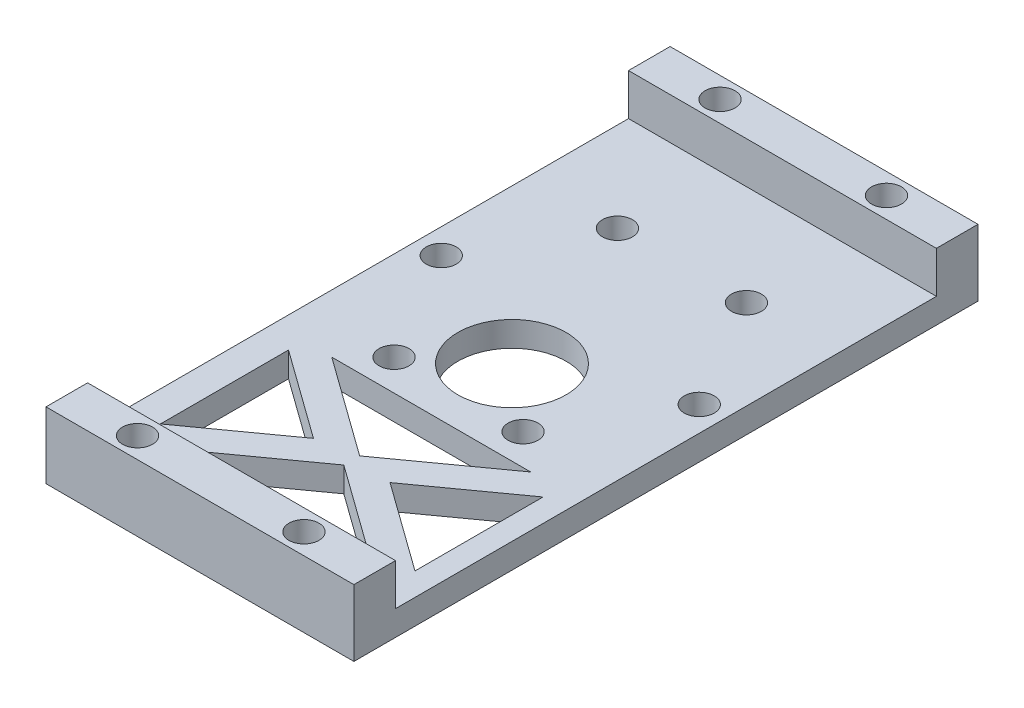
ISO-10303-21;
HEADER;
FILE_DESCRIPTION(('STEP AP214'),'2;1');
FILE_NAME('part.step','',(''),(''),'','','');
FILE_SCHEMA(('AUTOMOTIVE_DESIGN { 1 0 10303 214 1 1 1 1 }'));
ENDSEC;
DATA;
#1=APPLICATION_CONTEXT('core data for automotive mechanical design processes');
#2=APPLICATION_PROTOCOL_DEFINITION('international standard','automotive_design',2000,#1);
#3=PRODUCT_CONTEXT('',#1,'mechanical');
#4=PRODUCT('Part','Part','',(#3));
#5=PRODUCT_RELATED_PRODUCT_CATEGORY('part','',(#4));
#6=PRODUCT_DEFINITION_FORMATION('','',#4);
#7=PRODUCT_DEFINITION_CONTEXT('part definition',#1,'design');
#8=PRODUCT_DEFINITION('design','',#6,#7);
#9=PRODUCT_DEFINITION_SHAPE('','',#8);
#10=(LENGTH_UNIT() NAMED_UNIT(*) SI_UNIT(.MILLI.,.METRE.));
#11=(NAMED_UNIT(*) PLANE_ANGLE_UNIT() SI_UNIT($,.RADIAN.));
#12=(NAMED_UNIT(*) SI_UNIT($,.STERADIAN.) SOLID_ANGLE_UNIT());
#13=UNCERTAINTY_MEASURE_WITH_UNIT(LENGTH_MEASURE(1.E-05),#10,'distance_accuracy_value','');
#14=(GEOMETRIC_REPRESENTATION_CONTEXT(3) GLOBAL_UNCERTAINTY_ASSIGNED_CONTEXT((#13)) GLOBAL_UNIT_ASSIGNED_CONTEXT((#10,
#11,#12)) REPRESENTATION_CONTEXT('',''));
#15=CARTESIAN_POINT('',(0.,0.,0.));
#16=DIRECTION('',(0.,0.,1.));
#17=DIRECTION('',(1.,0.,0.));
#18=AXIS2_PLACEMENT_3D('',#15,#16,#17);
#19=CARTESIAN_POINT('',(0.,3.,0.));
#20=DIRECTION('',(0.,1.,0.));
#21=DIRECTION('',(0.,0.,1.));
#22=AXIS2_PLACEMENT_3D('',#19,#20,#21);
#23=PLANE('',#22);
#24=CARTESIAN_POINT('',(-7.75,3.,13.4233937586588));
#25=DIRECTION('',(0.,1.,0.));
#26=DIRECTION('',(0.,0.,1.));
#27=AXIS2_PLACEMENT_3D('',#24,#25,#26);
#28=CIRCLE('',#27,1.8);
#29=CARTESIAN_POINT('',(-7.75,3.,15.2233937586588));
#30=VERTEX_POINT('',#29);
#31=EDGE_CURVE('E340',#30,#30,#28,.T.);
#32=ORIENTED_EDGE('',*,*,#31,.F.);
#33=EDGE_LOOP('',(#32));
#34=FACE_BOUND('',#33,.T.);
#35=CARTESIAN_POINT('',(15.5,3.,0.));
#36=DIRECTION('',(0.,1.,0.));
#37=DIRECTION('',(0.,0.,1.));
#38=AXIS2_PLACEMENT_3D('',#35,#36,#37);
#39=CIRCLE('',#38,1.8);
#40=CARTESIAN_POINT('',(15.5,3.,1.8));
#41=VERTEX_POINT('',#40);
#42=EDGE_CURVE('E329',#41,#41,#39,.T.);
#43=ORIENTED_EDGE('',*,*,#42,.F.);
#44=EDGE_LOOP('',(#43));
#45=FACE_BOUND('',#44,.T.);
#46=CARTESIAN_POINT('',(-7.75000000000001,3.,-13.4233937586588));
#47=DIRECTION('',(0.,1.,0.));
#48=DIRECTION('',(0.,0.,1.));
#49=AXIS2_PLACEMENT_3D('',#46,#47,#48);
#50=CIRCLE('',#49,1.8);
#51=CARTESIAN_POINT('',(-7.75000000000001,3.,-11.6233937586588));
#52=VERTEX_POINT('',#51);
#53=EDGE_CURVE('E316',#52,#52,#50,.T.);
#54=ORIENTED_EDGE('',*,*,#53,.F.);
#55=EDGE_LOOP('',(#54));
#56=FACE_BOUND('',#55,.T.);
#57=CARTESIAN_POINT('',(-15.5,3.,0.));
#58=DIRECTION('',(0.,1.,0.));
#59=DIRECTION('',(0.,0.,1.));
#60=AXIS2_PLACEMENT_3D('',#57,#58,#59);
#61=CIRCLE('',#60,1.8);
#62=CARTESIAN_POINT('',(-15.5,3.,1.8));
#63=VERTEX_POINT('',#62);
#64=EDGE_CURVE('E313',#63,#63,#61,.T.);
#65=ORIENTED_EDGE('',*,*,#64,.F.);
#66=EDGE_LOOP('',(#65));
#67=FACE_BOUND('',#66,.T.);
#68=CARTESIAN_POINT('',(7.74999999999999,3.,-13.4233937586588));
#69=DIRECTION('',(0.,1.,0.));
#70=DIRECTION('',(0.,0.,1.));
#71=AXIS2_PLACEMENT_3D('',#68,#69,#70);
#72=CIRCLE('',#71,1.8);
#73=CARTESIAN_POINT('',(7.74999999999999,3.,-11.6233937586588));
#74=VERTEX_POINT('',#73);
#75=EDGE_CURVE('E323',#74,#74,#72,.T.);
#76=ORIENTED_EDGE('',*,*,#75,.F.);
#77=EDGE_LOOP('',(#76));
#78=FACE_BOUND('',#77,.T.);
#79=CARTESIAN_POINT('',(7.75,3.,13.4233937586588));
#80=DIRECTION('',(0.,1.,0.));
#81=DIRECTION('',(0.,0.,1.));
#82=AXIS2_PLACEMENT_3D('',#79,#80,#81);
#83=CIRCLE('',#82,1.8);
#84=CARTESIAN_POINT('',(7.75,3.,15.2233937586588));
#85=VERTEX_POINT('',#84);
#86=EDGE_CURVE('E335',#85,#85,#83,.T.);
#87=ORIENTED_EDGE('',*,*,#86,.F.);
#88=EDGE_LOOP('',(#87));
#89=FACE_BOUND('',#88,.T.);
#90=CARTESIAN_POINT('',(0.,3.,7.));
#91=DIRECTION('',(0.,1.,0.));
#92=DIRECTION('',(0.,0.,1.));
#93=AXIS2_PLACEMENT_3D('',#90,#91,#92);
#94=CIRCLE('',#93,6.5);
#95=CARTESIAN_POINT('',(0.,3.,13.5));
#96=VERTEX_POINT('',#95);
#97=EDGE_CURVE('E345',#96,#96,#94,.T.);
#98=ORIENTED_EDGE('',*,*,#97,.F.);
#99=EDGE_LOOP('',(#98));
#100=FACE_BOUND('',#99,.T.);
#101=DIRECTION('',(-0.81166315089851,0.,0.584125782236585));
#102=VECTOR('',#101,1.);
#103=CARTESIAN_POINT('',(13.2670600520474,3.,18.4350427467403));
#104=LINE('',#103,#102);
#105=CARTESIAN_POINT('',(0.450193864732995,3.,27.6588962371925));
#106=VERTEX_POINT('',#105);
#107=CARTESIAN_POINT('',(-11.5049543209545,3.,36.2626012076454));
#108=VERTEX_POINT('',#107);
#109=EDGE_CURVE('E371',#106,#108,#104,.T.);
#110=ORIENTED_EDGE('',*,*,#109,.F.);
#111=DIRECTION('',(-0.81166315089851,0.,-0.584125782236585));
#112=VECTOR('',#111,1.);
#113=CARTESIAN_POINT('',(-12.9598451210916,3.,18.0081568833773));
#114=LINE('',#113,#112);
#115=CARTESIAN_POINT('',(12.4053420504205,3.,36.2626012076454));
#116=VERTEX_POINT('',#115);
#117=EDGE_CURVE('E365',#116,#106,#114,.T.);
#118=ORIENTED_EDGE('',*,*,#117,.F.);
#119=DIRECTION('',(1.,0.,0.));
#120=VECTOR('',#119,1.);
#121=CARTESIAN_POINT('',(0.,3.,36.2626012076454));
#122=LINE('',#121,#120);
#123=EDGE_CURVE('E368',#108,#116,#122,.T.);
#124=ORIENTED_EDGE('',*,*,#123,.F.);
#125=EDGE_LOOP('',(#110,#118,#124));
#126=FACE_BOUND('',#125,.T.);
#127=DIRECTION('',(0.,0.,-1.));
#128=VECTOR('',#127,1.);
#129=CARTESIAN_POINT('',(15.7466208632358,3.,0.));
#130=LINE('',#129,#128);
#131=CARTESIAN_POINT('',(15.7466208632358,3.,34.4050964006598));
#132=VERTEX_POINT('',#131);
#133=CARTESIAN_POINT('',(15.7466208632358,3.,19.0118775337415));
#134=VERTEX_POINT('',#133);
#135=EDGE_CURVE('E378',#132,#134,#130,.T.);
#136=ORIENTED_EDGE('',*,*,#135,.F.);
#137=DIRECTION('',(0.811663150898511,0.,0.584125782236585));
#138=VECTOR('',#137,1.);
#139=CARTESIAN_POINT('',(-10.9391231326954,3.,15.2002931901988));
#140=LINE('',#139,#138);
#141=CARTESIAN_POINT('',(5.05191356906877,3.,26.7084869672006));
#142=VERTEX_POINT('',#141);
#143=EDGE_CURVE('E373',#142,#132,#140,.T.);
#144=ORIENTED_EDGE('',*,*,#143,.F.);
#145=DIRECTION('',(-0.81166315089851,0.,0.584125782236585));
#146=VECTOR('',#145,1.);
#147=CARTESIAN_POINT('',(14.3865785511218,3.,19.990652754175));
#148=LINE('',#147,#146);
#149=EDGE_CURVE('E375',#134,#142,#148,.T.);
#150=ORIENTED_EDGE('',*,*,#149,.F.);
#151=EDGE_LOOP('',(#136,#144,#150));
#152=FACE_BOUND('',#151,.T.);
#153=DIRECTION('',(0.81166315089851,0.,-0.584125782236585));
#154=VECTOR('',#153,1.);
#155=CARTESIAN_POINT('',(12.3658565627255,3.,17.1827890609965));
#156=LINE('',#155,#154);
#157=CARTESIAN_POINT('',(0.450193864732995,3.,25.7580776972088));
#158=VERTEX_POINT('',#157);
#159=CARTESIAN_POINT('',(12.4053420504205,3.,17.1543727267559));
#160=VERTEX_POINT('',#159);
#161=EDGE_CURVE('E385',#158,#160,#156,.T.);
#162=ORIENTED_EDGE('',*,*,#161,.F.);
#163=DIRECTION('',(0.81166315089851,0.,0.584125782236585));
#164=VECTOR('',#163,1.);
#165=CARTESIAN_POINT('',(-12.0586416317698,3.,16.7559031976336));
#166=LINE('',#165,#164);
#167=CARTESIAN_POINT('',(-11.5049543209545,3.,17.1543727267559));
#168=VERTEX_POINT('',#167);
#169=EDGE_CURVE('E380',#168,#158,#166,.T.);
#170=ORIENTED_EDGE('',*,*,#169,.F.);
#171=DIRECTION('',(-1.,0.,0.));
#172=VECTOR('',#171,1.);
#173=CARTESIAN_POINT('',(0.,3.,17.1543727267559));
#174=LINE('',#173,#172);
#175=EDGE_CURVE('E382',#160,#168,#174,.T.);
#176=ORIENTED_EDGE('',*,*,#175,.F.);
#177=EDGE_LOOP('',(#162,#170,#176));
#178=FACE_BOUND('',#177,.T.);
#179=DIRECTION('',(0.81166315089851,0.,-0.584125782236585));
#180=VECTOR('',#179,1.);
#181=CARTESIAN_POINT('',(11.2463380636512,3.,15.6271790535618));
#182=LINE('',#181,#180);
#183=CARTESIAN_POINT('',(-14.8462331337698,3.,34.4050964006598));
#184=VERTEX_POINT('',#183);
#185=CARTESIAN_POINT('',(-4.15152583960277,3.,26.7084869672006));
#186=VERTEX_POINT('',#185);
#187=EDGE_CURVE('E11',#184,#186,#182,.T.);
#188=ORIENTED_EDGE('',*,*,#187,.F.);
#189=DIRECTION('',(0.,0.,1.));
#190=VECTOR('',#189,1.);
#191=CARTESIAN_POINT('',(-14.8462331337698,3.,0.));
#192=LINE('',#191,#190);
#193=CARTESIAN_POINT('',(-14.8462331337698,3.,19.0118775337415));
#194=VERTEX_POINT('',#193);
#195=EDGE_CURVE('E387',#194,#184,#192,.T.);
#196=ORIENTED_EDGE('',*,*,#195,.F.);
#197=DIRECTION('',(-0.81166315089851,0.,-0.584125782236585));
#198=VECTOR('',#197,1.);
#199=CARTESIAN_POINT('',(-14.079363620166,3.,19.563766890812));
#200=LINE('',#199,#198);
#201=EDGE_CURVE('E45',#186,#194,#200,.T.);
#202=ORIENTED_EDGE('',*,*,#201,.F.);
#203=EDGE_LOOP('',(#188,#196,#202));
#204=FACE_BOUND('',#203,.T.);
#205=DIRECTION('',(0.,0.,-1.));
#206=VECTOR('',#205,1.);
#207=CARTESIAN_POINT('',(-18.5,3.,0.));
#208=LINE('',#207,#206);
#209=CARTESIAN_POINT('',(-18.5,3.,39.5));
#210=VERTEX_POINT('',#209);
#211=CARTESIAN_POINT('',(-18.5,3.,-25.5));
#212=VERTEX_POINT('',#211);
#213=EDGE_CURVE('E57',#210,#212,#208,.T.);
#214=ORIENTED_EDGE('',*,*,#213,.F.);
#215=DIRECTION('',(-1.,0.,0.));
#216=VECTOR('',#215,1.);
#217=CARTESIAN_POINT('',(-18.5,3.,39.5));
#218=LINE('',#217,#216);
#219=CARTESIAN_POINT('',(18.5,3.,39.5));
#220=VERTEX_POINT('',#219);
#221=EDGE_CURVE('E197',#220,#210,#218,.T.);
#222=ORIENTED_EDGE('',*,*,#221,.F.);
#223=DIRECTION('',(0.,0.,1.));
#224=VECTOR('',#223,1.);
#225=CARTESIAN_POINT('',(18.5,3.,0.));
#226=LINE('',#225,#224);
#227=CARTESIAN_POINT('',(18.5,3.,-25.5));
#228=VERTEX_POINT('',#227);
#229=EDGE_CURVE('E355',#228,#220,#226,.T.);
#230=ORIENTED_EDGE('',*,*,#229,.F.);
#231=DIRECTION('',(1.,0.,0.));
#232=VECTOR('',#231,1.);
#233=CARTESIAN_POINT('',(-18.5,3.,-25.5));
#234=LINE('',#233,#232);
#235=EDGE_CURVE('E215',#212,#228,#234,.T.);
#236=ORIENTED_EDGE('',*,*,#235,.F.);
#237=EDGE_LOOP('',(#214,#222,#230,#236));
#238=FACE_BOUND('',#237,.T.);
#239=ADVANCED_FACE('F37',(#34,#45,#56,#67,#78,#89,#100,#126,#152,#178,#204,#238),#23,.T.);
#240=CARTESIAN_POINT('',(0.,0.,0.));
#241=DIRECTION('',(0.,1.,0.));
#242=DIRECTION('',(0.,0.,1.));
#243=AXIS2_PLACEMENT_3D('',#240,#241,#242);
#244=PLANE('',#243);
#245=DIRECTION('',(0.,0.,-1.));
#246=VECTOR('',#245,1.);
#247=CARTESIAN_POINT('',(-14.8462331337698,0.,34.4050964006598));
#248=LINE('',#247,#246);
#249=CARTESIAN_POINT('',(-14.8462331337698,0.,34.4050964006598));
#250=VERTEX_POINT('',#249);
#251=CARTESIAN_POINT('',(-14.8462331337698,0.,19.0118775337415));
#252=VERTEX_POINT('',#251);
#253=EDGE_CURVE('E252',#250,#252,#248,.T.);
#254=ORIENTED_EDGE('',*,*,#253,.F.);
#255=DIRECTION('',(-0.81166315089851,0.,0.584125782236585));
#256=VECTOR('',#255,1.);
#257=CARTESIAN_POINT('',(-4.15152583960277,0.,26.7084869672006));
#258=LINE('',#257,#256);
#259=CARTESIAN_POINT('',(-4.15152583960277,0.,26.7084869672006));
#260=VERTEX_POINT('',#259);
#261=EDGE_CURVE('E246',#260,#250,#258,.T.);
#262=ORIENTED_EDGE('',*,*,#261,.F.);
#263=DIRECTION('',(0.81166315089851,0.,0.584125782236585));
#264=VECTOR('',#263,1.);
#265=CARTESIAN_POINT('',(-14.8462331337698,0.,19.0118775337415));
#266=LINE('',#265,#264);
#267=EDGE_CURVE('E255',#252,#260,#266,.T.);
#268=ORIENTED_EDGE('',*,*,#267,.F.);
#269=EDGE_LOOP('',(#254,#262,#268));
#270=FACE_BOUND('',#269,.T.);
#271=DIRECTION('',(-0.81166315089851,0.,-0.584125782236585));
#272=VECTOR('',#271,1.);
#273=CARTESIAN_POINT('',(0.450193864732995,0.,25.7580776972088));
#274=LINE('',#273,#272);
#275=CARTESIAN_POINT('',(0.450193864732995,0.,25.7580776972088));
#276=VERTEX_POINT('',#275);
#277=CARTESIAN_POINT('',(-11.5049543209545,0.,17.1543727267559));
#278=VERTEX_POINT('',#277);
#279=EDGE_CURVE('E267',#276,#278,#274,.T.);
#280=ORIENTED_EDGE('',*,*,#279,.F.);
#281=DIRECTION('',(-0.81166315089851,0.,0.584125782236585));
#282=VECTOR('',#281,1.);
#283=CARTESIAN_POINT('',(12.4053420504205,0.,17.1543727267559));
#284=LINE('',#283,#282);
#285=CARTESIAN_POINT('',(12.4053420504205,0.,17.1543727267559));
#286=VERTEX_POINT('',#285);
#287=EDGE_CURVE('E261',#286,#276,#284,.T.);
#288=ORIENTED_EDGE('',*,*,#287,.F.);
#289=DIRECTION('',(1.,0.,0.));
#290=VECTOR('',#289,1.);
#291=CARTESIAN_POINT('',(-11.5049543209545,0.,17.1543727267559));
#292=LINE('',#291,#290);
#293=EDGE_CURVE('E270',#278,#286,#292,.T.);
#294=ORIENTED_EDGE('',*,*,#293,.F.);
#295=EDGE_LOOP('',(#280,#288,#294));
#296=FACE_BOUND('',#295,.T.);
#297=DIRECTION('',(-0.81166315089851,0.,-0.584125782236585));
#298=VECTOR('',#297,1.);
#299=CARTESIAN_POINT('',(5.05191356906876,0.,26.7084869672006));
#300=LINE('',#299,#298);
#301=CARTESIAN_POINT('',(15.7466208632358,0.,34.4050964006598));
#302=VERTEX_POINT('',#301);
#303=CARTESIAN_POINT('',(5.05191356906876,0.,26.7084869672006));
#304=VERTEX_POINT('',#303);
#305=EDGE_CURVE('E237',#302,#304,#300,.T.);
#306=ORIENTED_EDGE('',*,*,#305,.F.);
#307=DIRECTION('',(0.,0.,1.));
#308=VECTOR('',#307,1.);
#309=CARTESIAN_POINT('',(15.7466208632358,0.,34.4050964006598));
#310=LINE('',#309,#308);
#311=CARTESIAN_POINT('',(15.7466208632358,0.,19.0118775337415));
#312=VERTEX_POINT('',#311);
#313=EDGE_CURVE('E235',#312,#302,#310,.T.);
#314=ORIENTED_EDGE('',*,*,#313,.F.);
#315=DIRECTION('',(0.81166315089851,0.,-0.584125782236585));
#316=VECTOR('',#315,1.);
#317=CARTESIAN_POINT('',(15.7466208632358,0.,19.0118775337415));
#318=LINE('',#317,#316);
#319=EDGE_CURVE('E240',#304,#312,#318,.T.);
#320=ORIENTED_EDGE('',*,*,#319,.F.);
#321=EDGE_LOOP('',(#306,#314,#320));
#322=FACE_BOUND('',#321,.T.);
#323=DIRECTION('',(0.81166315089851,0.,0.584125782236585));
#324=VECTOR('',#323,1.);
#325=CARTESIAN_POINT('',(12.4053420504205,0.,36.2626012076454));
#326=LINE('',#325,#324);
#327=CARTESIAN_POINT('',(0.450193864732995,0.,27.6588962371925));
#328=VERTEX_POINT('',#327);
#329=CARTESIAN_POINT('',(12.4053420504205,0.,36.2626012076454));
#330=VERTEX_POINT('',#329);
#331=EDGE_CURVE('E282',#328,#330,#326,.T.);
#332=ORIENTED_EDGE('',*,*,#331,.F.);
#333=DIRECTION('',(0.81166315089851,0.,-0.584125782236585));
#334=VECTOR('',#333,1.);
#335=CARTESIAN_POINT('',(0.450193864732995,0.,27.6588962371925));
#336=LINE('',#335,#334);
#337=CARTESIAN_POINT('',(-11.5049543209545,0.,36.2626012076454));
#338=VERTEX_POINT('',#337);
#339=EDGE_CURVE('E276',#338,#328,#336,.T.);
#340=ORIENTED_EDGE('',*,*,#339,.F.);
#341=DIRECTION('',(-1.,0.,0.));
#342=VECTOR('',#341,1.);
#343=CARTESIAN_POINT('',(-11.5049543209545,0.,36.2626012076454));
#344=LINE('',#343,#342);
#345=EDGE_CURVE('E285',#330,#338,#344,.T.);
#346=ORIENTED_EDGE('',*,*,#345,.F.);
#347=EDGE_LOOP('',(#332,#340,#346));
#348=FACE_BOUND('',#347,.T.);
#349=CARTESIAN_POINT('',(-10.,0.,42.));
#350=DIRECTION('',(0.,-1.,0.));
#351=DIRECTION('',(0.,0.,-1.));
#352=AXIS2_PLACEMENT_3D('',#349,#350,#351);
#353=CIRCLE('',#352,1.8);
#354=CARTESIAN_POINT('',(-10.,0.,40.2));
#355=VERTEX_POINT('',#354);
#356=EDGE_CURVE('E296',#355,#355,#353,.T.);
#357=ORIENTED_EDGE('',*,*,#356,.F.);
#358=EDGE_LOOP('',(#357));
#359=FACE_BOUND('',#358,.T.);
#360=CARTESIAN_POINT('',(9.99999999999999,0.,42.));
#361=DIRECTION('',(0.,-1.,0.));
#362=DIRECTION('',(0.,0.,-1.));
#363=AXIS2_PLACEMENT_3D('',#360,#361,#362);
#364=CIRCLE('',#363,1.8);
#365=CARTESIAN_POINT('',(9.99999999999999,0.,40.2));
#366=VERTEX_POINT('',#365);
#367=EDGE_CURVE('E300',#366,#366,#364,.T.);
#368=ORIENTED_EDGE('',*,*,#367,.F.);
#369=EDGE_LOOP('',(#368));
#370=FACE_BOUND('',#369,.T.);
#371=CARTESIAN_POINT('',(-10.,0.,-28.));
#372=DIRECTION('',(0.,-1.,0.));
#373=DIRECTION('',(0.,0.,-1.));
#374=AXIS2_PLACEMENT_3D('',#371,#372,#373);
#375=CIRCLE('',#374,1.8);
#376=CARTESIAN_POINT('',(-10.,0.,-29.8));
#377=VERTEX_POINT('',#376);
#378=EDGE_CURVE('E303',#377,#377,#375,.T.);
#379=ORIENTED_EDGE('',*,*,#378,.F.);
#380=EDGE_LOOP('',(#379));
#381=FACE_BOUND('',#380,.T.);
#382=CARTESIAN_POINT('',(10.,0.,-28.));
#383=DIRECTION('',(0.,-1.,0.));
#384=DIRECTION('',(0.,0.,-1.));
#385=AXIS2_PLACEMENT_3D('',#382,#383,#384);
#386=CIRCLE('',#385,1.8);
#387=CARTESIAN_POINT('',(10.,0.,-29.8));
#388=VERTEX_POINT('',#387);
#389=EDGE_CURVE('E291',#388,#388,#386,.T.);
#390=ORIENTED_EDGE('',*,*,#389,.F.);
#391=EDGE_LOOP('',(#390));
#392=FACE_BOUND('',#391,.T.);
#393=CARTESIAN_POINT('',(0.,0.,7.));
#394=DIRECTION('',(0.,1.,0.));
#395=DIRECTION('',(0.,0.,1.));
#396=AXIS2_PLACEMENT_3D('',#393,#394,#395);
#397=CIRCLE('',#396,6.5);
#398=CARTESIAN_POINT('',(0.,0.,13.5));
#399=VERTEX_POINT('',#398);
#400=EDGE_CURVE('E299',#399,#399,#397,.T.);
#401=ORIENTED_EDGE('',*,*,#400,.T.);
#402=EDGE_LOOP('',(#401));
#403=FACE_BOUND('',#402,.T.);
#404=DIRECTION('',(0.,0.,-1.));
#405=VECTOR('',#404,1.);
#406=CARTESIAN_POINT('',(18.5,0.,0.));
#407=LINE('',#406,#405);
#408=CARTESIAN_POINT('',(18.5,0.,44.5));
#409=VERTEX_POINT('',#408);
#410=CARTESIAN_POINT('',(18.5,0.,-30.5));
#411=VERTEX_POINT('',#410);
#412=EDGE_CURVE('E356',#409,#411,#407,.T.);
#413=ORIENTED_EDGE('',*,*,#412,.F.);
#414=DIRECTION('',(-1.,0.,0.));
#415=VECTOR('',#414,1.);
#416=CARTESIAN_POINT('',(0.,0.,44.5));
#417=LINE('',#416,#415);
#418=CARTESIAN_POINT('',(-18.5,0.,44.5));
#419=VERTEX_POINT('',#418);
#420=EDGE_CURVE('E312',#409,#419,#417,.T.);
#421=ORIENTED_EDGE('',*,*,#420,.T.);
#422=DIRECTION('',(0.,0.,1.));
#423=VECTOR('',#422,1.);
#424=CARTESIAN_POINT('',(-18.5,0.,0.));
#425=LINE('',#424,#423);
#426=CARTESIAN_POINT('',(-18.5,0.,-30.5));
#427=VERTEX_POINT('',#426);
#428=EDGE_CURVE('E178',#427,#419,#425,.T.);
#429=ORIENTED_EDGE('',*,*,#428,.F.);
#430=DIRECTION('',(-1.,0.,0.));
#431=VECTOR('',#430,1.);
#432=CARTESIAN_POINT('',(0.,0.,-30.5));
#433=LINE('',#432,#431);
#434=EDGE_CURVE('E182',#411,#427,#433,.T.);
#435=ORIENTED_EDGE('',*,*,#434,.F.);
#436=EDGE_LOOP('',(#413,#421,#429,#435));
#437=FACE_BOUND('',#436,.T.);
#438=CARTESIAN_POINT('',(-15.5,0.,0.));
#439=DIRECTION('',(0.,1.,0.));
#440=DIRECTION('',(0.,0.,1.));
#441=AXIS2_PLACEMENT_3D('',#438,#439,#440);
#442=CIRCLE('',#441,1.8);
#443=CARTESIAN_POINT('',(-15.5,0.,1.8));
#444=VERTEX_POINT('',#443);
#445=EDGE_CURVE('E308',#444,#444,#442,.T.);
#446=ORIENTED_EDGE('',*,*,#445,.T.);
#447=EDGE_LOOP('',(#446));
#448=FACE_BOUND('',#447,.T.);
#449=CARTESIAN_POINT('',(-7.75000000000001,0.,-13.4233937586588));
#450=DIRECTION('',(0.,1.,0.));
#451=DIRECTION('',(0.,0.,1.));
#452=AXIS2_PLACEMENT_3D('',#449,#450,#451);
#453=CIRCLE('',#452,1.8);
#454=CARTESIAN_POINT('',(-7.75000000000001,0.,-11.6233937586588));
#455=VERTEX_POINT('',#454);
#456=EDGE_CURVE('E311',#455,#455,#453,.T.);
#457=ORIENTED_EDGE('',*,*,#456,.T.);
#458=EDGE_LOOP('',(#457));
#459=FACE_BOUND('',#458,.T.);
#460=CARTESIAN_POINT('',(7.74999999999999,0.,-13.4233937586588));
#461=DIRECTION('',(0.,1.,0.));
#462=DIRECTION('',(0.,0.,1.));
#463=AXIS2_PLACEMENT_3D('',#460,#461,#462);
#464=CIRCLE('',#463,1.8);
#465=CARTESIAN_POINT('',(7.74999999999999,0.,-11.6233937586588));
#466=VERTEX_POINT('',#465);
#467=EDGE_CURVE('E320',#466,#466,#464,.T.);
#468=ORIENTED_EDGE('',*,*,#467,.T.);
#469=EDGE_LOOP('',(#468));
#470=FACE_BOUND('',#469,.T.);
#471=CARTESIAN_POINT('',(15.5,0.,0.));
#472=DIRECTION('',(0.,1.,0.));
#473=DIRECTION('',(0.,0.,1.));
#474=AXIS2_PLACEMENT_3D('',#471,#472,#473);
#475=CIRCLE('',#474,1.8);
#476=CARTESIAN_POINT('',(15.5,0.,1.8));
#477=VERTEX_POINT('',#476);
#478=EDGE_CURVE('E326',#477,#477,#475,.T.);
#479=ORIENTED_EDGE('',*,*,#478,.T.);
#480=EDGE_LOOP('',(#479));
#481=FACE_BOUND('',#480,.T.);
#482=CARTESIAN_POINT('',(7.75,0.,13.4233937586588));
#483=DIRECTION('',(0.,1.,0.));
#484=DIRECTION('',(0.,0.,1.));
#485=AXIS2_PLACEMENT_3D('',#482,#483,#484);
#486=CIRCLE('',#485,1.8);
#487=CARTESIAN_POINT('',(7.75,0.,15.2233937586588));
#488=VERTEX_POINT('',#487);
#489=EDGE_CURVE('E332',#488,#488,#486,.T.);
#490=ORIENTED_EDGE('',*,*,#489,.T.);
#491=EDGE_LOOP('',(#490));
#492=FACE_BOUND('',#491,.T.);
#493=CARTESIAN_POINT('',(-7.75,0.,13.4233937586588));
#494=DIRECTION('',(0.,1.,0.));
#495=DIRECTION('',(0.,0.,1.));
#496=AXIS2_PLACEMENT_3D('',#493,#494,#495);
#497=CIRCLE('',#496,1.8);
#498=CARTESIAN_POINT('',(-7.75,0.,15.2233937586588));
#499=VERTEX_POINT('',#498);
#500=EDGE_CURVE('E317',#499,#499,#497,.T.);
#501=ORIENTED_EDGE('',*,*,#500,.T.);
#502=EDGE_LOOP('',(#501));
#503=FACE_BOUND('',#502,.T.);
#504=ADVANCED_FACE('F406',(#270,#296,#322,#348,#359,#370,#381,#392,#403,#437,#448,#459,#470,
#481,#492,#503),#244,.F.);
#505=CARTESIAN_POINT('',(-7.75,3.,13.4233937586588));
#506=DIRECTION('',(0.,-1.,0.));
#507=DIRECTION('',(0.,0.,-1.));
#508=AXIS2_PLACEMENT_3D('',#505,#506,#507);
#509=CYLINDRICAL_SURFACE('',#508,1.8);
#510=ORIENTED_EDGE('',*,*,#31,.T.);
#511=EDGE_LOOP('',(#510));
#512=FACE_BOUND('',#511,.T.);
#513=ORIENTED_EDGE('',*,*,#500,.F.);
#514=EDGE_LOOP('',(#513));
#515=FACE_BOUND('',#514,.T.);
#516=ADVANCED_FACE('F409',(#512,#515),#509,.F.);
#517=CARTESIAN_POINT('',(15.5,3.,0.));
#518=DIRECTION('',(0.,-1.,0.));
#519=DIRECTION('',(0.,0.,-1.));
#520=AXIS2_PLACEMENT_3D('',#517,#518,#519);
#521=CYLINDRICAL_SURFACE('',#520,1.8);
#522=ORIENTED_EDGE('',*,*,#42,.T.);
#523=EDGE_LOOP('',(#522));
#524=FACE_BOUND('',#523,.T.);
#525=ORIENTED_EDGE('',*,*,#478,.F.);
#526=EDGE_LOOP('',(#525));
#527=FACE_BOUND('',#526,.T.);
#528=ADVANCED_FACE('F447',(#524,#527),#521,.F.);
#529=CARTESIAN_POINT('',(-7.75000000000001,3.,-13.4233937586588));
#530=DIRECTION('',(0.,-1.,0.));
#531=DIRECTION('',(0.,0.,-1.));
#532=AXIS2_PLACEMENT_3D('',#529,#530,#531);
#533=CYLINDRICAL_SURFACE('',#532,1.8);
#534=ORIENTED_EDGE('',*,*,#53,.T.);
#535=EDGE_LOOP('',(#534));
#536=FACE_BOUND('',#535,.T.);
#537=ORIENTED_EDGE('',*,*,#456,.F.);
#538=EDGE_LOOP('',(#537));
#539=FACE_BOUND('',#538,.T.);
#540=ADVANCED_FACE('F453',(#536,#539),#533,.F.);
#541=CARTESIAN_POINT('',(-15.5,3.,0.));
#542=DIRECTION('',(0.,-1.,0.));
#543=DIRECTION('',(0.,0.,-1.));
#544=AXIS2_PLACEMENT_3D('',#541,#542,#543);
#545=CYLINDRICAL_SURFACE('',#544,1.8);
#546=ORIENTED_EDGE('',*,*,#64,.T.);
#547=EDGE_LOOP('',(#546));
#548=FACE_BOUND('',#547,.T.);
#549=ORIENTED_EDGE('',*,*,#445,.F.);
#550=EDGE_LOOP('',(#549));
#551=FACE_BOUND('',#550,.T.);
#552=ADVANCED_FACE('F469',(#548,#551),#545,.F.);
#553=CARTESIAN_POINT('',(7.74999999999999,3.,-13.4233937586588));
#554=DIRECTION('',(0.,-1.,0.));
#555=DIRECTION('',(0.,0.,-1.));
#556=AXIS2_PLACEMENT_3D('',#553,#554,#555);
#557=CYLINDRICAL_SURFACE('',#556,1.8);
#558=ORIENTED_EDGE('',*,*,#75,.T.);
#559=EDGE_LOOP('',(#558));
#560=FACE_BOUND('',#559,.T.);
#561=ORIENTED_EDGE('',*,*,#467,.F.);
#562=EDGE_LOOP('',(#561));
#563=FACE_BOUND('',#562,.T.);
#564=ADVANCED_FACE('F472',(#560,#563),#557,.F.);
#565=CARTESIAN_POINT('',(7.75,3.,13.4233937586588));
#566=DIRECTION('',(0.,-1.,0.));
#567=DIRECTION('',(0.,0.,-1.));
#568=AXIS2_PLACEMENT_3D('',#565,#566,#567);
#569=CYLINDRICAL_SURFACE('',#568,1.8);
#570=ORIENTED_EDGE('',*,*,#86,.T.);
#571=EDGE_LOOP('',(#570));
#572=FACE_BOUND('',#571,.T.);
#573=ORIENTED_EDGE('',*,*,#489,.F.);
#574=EDGE_LOOP('',(#573));
#575=FACE_BOUND('',#574,.T.);
#576=ADVANCED_FACE('F478',(#572,#575),#569,.F.);
#577=CARTESIAN_POINT('',(0.,0.,7.));
#578=DIRECTION('',(0.,1.,0.));
#579=DIRECTION('',(0.,0.,1.));
#580=AXIS2_PLACEMENT_3D('',#577,#578,#579);
#581=CYLINDRICAL_SURFACE('',#580,6.5);
#582=ORIENTED_EDGE('',*,*,#400,.F.);
#583=EDGE_LOOP('',(#582));
#584=FACE_BOUND('',#583,.T.);
#585=ORIENTED_EDGE('',*,*,#97,.T.);
#586=EDGE_LOOP('',(#585));
#587=FACE_BOUND('',#586,.T.);
#588=ADVANCED_FACE('F481',(#584,#587),#581,.F.);
#589=CARTESIAN_POINT('',(0.,-57.8727051380873,44.5));
#590=DIRECTION('',(0.,0.,1.));
#591=DIRECTION('',(1.,0.,0.));
#592=AXIS2_PLACEMENT_3D('',#589,#590,#591);
#593=PLANE('',#592);
#594=DIRECTION('',(0.,1.,0.));
#595=VECTOR('',#594,1.);
#596=CARTESIAN_POINT('',(18.5,-57.8727051380873,44.5));
#597=LINE('',#596,#595);
#598=CARTESIAN_POINT('',(18.5,8.,44.5));
#599=VERTEX_POINT('',#598);
#600=EDGE_CURVE('E188',#409,#599,#597,.T.);
#601=ORIENTED_EDGE('',*,*,#600,.T.);
#602=DIRECTION('',(1.,0.,0.));
#603=VECTOR('',#602,1.);
#604=CARTESIAN_POINT('',(-18.5,8.,44.5));
#605=LINE('',#604,#603);
#606=CARTESIAN_POINT('',(-18.5,8.,44.5));
#607=VERTEX_POINT('',#606);
#608=EDGE_CURVE('E185',#607,#599,#605,.T.);
#609=ORIENTED_EDGE('',*,*,#608,.F.);
#610=DIRECTION('',(0.,1.,0.));
#611=VECTOR('',#610,1.);
#612=CARTESIAN_POINT('',(-18.5,-57.8727051380873,44.5));
#613=LINE('',#612,#611);
#614=EDGE_CURVE('E172',#419,#607,#613,.T.);
#615=ORIENTED_EDGE('',*,*,#614,.F.);
#616=ORIENTED_EDGE('',*,*,#420,.F.);
#617=EDGE_LOOP('',(#601,#609,#615,#616));
#618=FACE_BOUND('',#617,.T.);
#619=ADVANCED_FACE('F186',(#618),#593,.T.);
#620=CARTESIAN_POINT('',(18.5,-57.8727051380873,0.));
#621=DIRECTION('',(-1.,0.,0.));
#622=DIRECTION('',(0.,0.,1.));
#623=AXIS2_PLACEMENT_3D('',#620,#621,#622);
#624=PLANE('',#623);
#625=DIRECTION('',(0.,1.,0.));
#626=VECTOR('',#625,1.);
#627=CARTESIAN_POINT('',(18.5,-57.8727051380873,-30.5));
#628=LINE('',#627,#626);
#629=CARTESIAN_POINT('',(18.5,8.,-30.5));
#630=VERTEX_POINT('',#629);
#631=EDGE_CURVE('E353',#411,#630,#628,.T.);
#632=ORIENTED_EDGE('',*,*,#631,.T.);
#633=DIRECTION('',(0.,0.,-1.));
#634=VECTOR('',#633,1.);
#635=CARTESIAN_POINT('',(18.5,8.,-30.5));
#636=LINE('',#635,#634);
#637=CARTESIAN_POINT('',(18.5,8.,-25.5));
#638=VERTEX_POINT('',#637);
#639=EDGE_CURVE('E221',#638,#630,#636,.T.);
#640=ORIENTED_EDGE('',*,*,#639,.F.);
#641=DIRECTION('',(0.,-1.,0.));
#642=VECTOR('',#641,1.);
#643=CARTESIAN_POINT('',(18.5,8.,-25.5));
#644=LINE('',#643,#642);
#645=EDGE_CURVE('E227',#638,#228,#644,.T.);
#646=ORIENTED_EDGE('',*,*,#645,.T.);
#647=ORIENTED_EDGE('',*,*,#229,.T.);
#648=DIRECTION('',(0.,-1.,0.));
#649=VECTOR('',#648,1.);
#650=CARTESIAN_POINT('',(18.5,8.,39.5));
#651=LINE('',#650,#649);
#652=CARTESIAN_POINT('',(18.5,8.,39.5));
#653=VERTEX_POINT('',#652);
#654=EDGE_CURVE('E207',#653,#220,#651,.T.);
#655=ORIENTED_EDGE('',*,*,#654,.F.);
#656=DIRECTION('',(0.,0.,-1.));
#657=VECTOR('',#656,1.);
#658=CARTESIAN_POINT('',(18.5,8.,44.5));
#659=LINE('',#658,#657);
#660=EDGE_CURVE('E191',#599,#653,#659,.T.);
#661=ORIENTED_EDGE('',*,*,#660,.F.);
#662=ORIENTED_EDGE('',*,*,#600,.F.);
#663=ORIENTED_EDGE('',*,*,#412,.T.);
#664=EDGE_LOOP('',(#632,#640,#646,#647,#655,#661,#662,#663));
#665=FACE_BOUND('',#664,.T.);
#666=ADVANCED_FACE('F39',(#665),#624,.F.);
#667=CARTESIAN_POINT('',(-18.5,-57.8727051380873,0.));
#668=DIRECTION('',(1.,0.,0.));
#669=DIRECTION('',(0.,0.,-1.));
#670=AXIS2_PLACEMENT_3D('',#667,#668,#669);
#671=PLANE('',#670);
#672=ORIENTED_EDGE('',*,*,#614,.T.);
#673=DIRECTION('',(0.,0.,1.));
#674=VECTOR('',#673,1.);
#675=CARTESIAN_POINT('',(-18.5,8.,44.5));
#676=LINE('',#675,#674);
#677=CARTESIAN_POINT('',(-18.5,8.,39.5));
#678=VERTEX_POINT('',#677);
#679=EDGE_CURVE('E176',#678,#607,#676,.T.);
#680=ORIENTED_EDGE('',*,*,#679,.F.);
#681=DIRECTION('',(0.,-1.,0.));
#682=VECTOR('',#681,1.);
#683=CARTESIAN_POINT('',(-18.5,8.,39.5));
#684=LINE('',#683,#682);
#685=EDGE_CURVE('E52',#678,#210,#684,.T.);
#686=ORIENTED_EDGE('',*,*,#685,.T.);
#687=ORIENTED_EDGE('',*,*,#213,.T.);
#688=DIRECTION('',(0.,-1.,0.));
#689=VECTOR('',#688,1.);
#690=CARTESIAN_POINT('',(-18.5,8.,-25.5));
#691=LINE('',#690,#689);
#692=CARTESIAN_POINT('',(-18.5,8.,-25.5));
#693=VERTEX_POINT('',#692);
#694=EDGE_CURVE('E232',#693,#212,#691,.T.);
#695=ORIENTED_EDGE('',*,*,#694,.F.);
#696=DIRECTION('',(0.,0.,1.));
#697=VECTOR('',#696,1.);
#698=CARTESIAN_POINT('',(-18.5,8.,-30.5));
#699=LINE('',#698,#697);
#700=CARTESIAN_POINT('',(-18.5,8.,-30.5));
#701=VERTEX_POINT('',#700);
#702=EDGE_CURVE('E216',#701,#693,#699,.T.);
#703=ORIENTED_EDGE('',*,*,#702,.F.);
#704=DIRECTION('',(0.,1.,0.));
#705=VECTOR('',#704,1.);
#706=CARTESIAN_POINT('',(-18.5,-57.8727051380873,-30.5));
#707=LINE('',#706,#705);
#708=EDGE_CURVE('E348',#427,#701,#707,.T.);
#709=ORIENTED_EDGE('',*,*,#708,.F.);
#710=ORIENTED_EDGE('',*,*,#428,.T.);
#711=EDGE_LOOP('',(#672,#680,#686,#687,#695,#703,#709,#710));
#712=FACE_BOUND('',#711,.T.);
#713=ADVANCED_FACE('F174',(#712),#671,.F.);
#714=CARTESIAN_POINT('',(0.,-57.8727051380873,-30.5));
#715=DIRECTION('',(0.,0.,1.));
#716=DIRECTION('',(1.,0.,0.));
#717=AXIS2_PLACEMENT_3D('',#714,#715,#716);
#718=PLANE('',#717);
#719=ORIENTED_EDGE('',*,*,#708,.T.);
#720=DIRECTION('',(-1.,0.,0.));
#721=VECTOR('',#720,1.);
#722=CARTESIAN_POINT('',(-18.5,8.,-30.5));
#723=LINE('',#722,#721);
#724=EDGE_CURVE('E224',#630,#701,#723,.T.);
#725=ORIENTED_EDGE('',*,*,#724,.F.);
#726=ORIENTED_EDGE('',*,*,#631,.F.);
#727=ORIENTED_EDGE('',*,*,#434,.T.);
#728=EDGE_LOOP('',(#719,#725,#726,#727));
#729=FACE_BOUND('',#728,.T.);
#730=ADVANCED_FACE('F550',(#729),#718,.F.);
#731=CARTESIAN_POINT('',(10.,6.,-28.));
#732=DIRECTION('',(0.,-1.,0.));
#733=DIRECTION('',(0.,0.,-1.));
#734=AXIS2_PLACEMENT_3D('',#731,#732,#733);
#735=CYLINDRICAL_SURFACE('',#734,1.8);
#736=ORIENTED_EDGE('',*,*,#389,.T.);
#737=EDGE_LOOP('',(#736));
#738=FACE_BOUND('',#737,.T.);
#739=CARTESIAN_POINT('',(10.,8.,-28.));
#740=DIRECTION('',(0.,1.,0.));
#741=DIRECTION('',(0.,0.,1.));
#742=AXIS2_PLACEMENT_3D('',#739,#740,#741);
#743=CIRCLE('',#742,1.8);
#744=CARTESIAN_POINT('',(10.,8.,-26.2));
#745=VERTEX_POINT('',#744);
#746=EDGE_CURVE('E212',#745,#745,#743,.T.);
#747=ORIENTED_EDGE('',*,*,#746,.T.);
#748=EDGE_LOOP('',(#747));
#749=FACE_BOUND('',#748,.T.);
#750=ADVANCED_FACE('F547',(#738,#749),#735,.F.);
#751=CARTESIAN_POINT('',(-10.,6.,-28.));
#752=DIRECTION('',(0.,-1.,0.));
#753=DIRECTION('',(0.,0.,-1.));
#754=AXIS2_PLACEMENT_3D('',#751,#752,#753);
#755=CYLINDRICAL_SURFACE('',#754,1.8);
#756=ORIENTED_EDGE('',*,*,#378,.T.);
#757=EDGE_LOOP('',(#756));
#758=FACE_BOUND('',#757,.T.);
#759=CARTESIAN_POINT('',(-10.,8.,-28.));
#760=DIRECTION('',(0.,1.,0.));
#761=DIRECTION('',(0.,0.,1.));
#762=AXIS2_PLACEMENT_3D('',#759,#760,#761);
#763=CIRCLE('',#762,1.8);
#764=CARTESIAN_POINT('',(-10.,8.,-26.2));
#765=VERTEX_POINT('',#764);
#766=EDGE_CURVE('E209',#765,#765,#763,.T.);
#767=ORIENTED_EDGE('',*,*,#766,.T.);
#768=EDGE_LOOP('',(#767));
#769=FACE_BOUND('',#768,.T.);
#770=ADVANCED_FACE('F544',(#758,#769),#755,.F.);
#771=CARTESIAN_POINT('',(9.99999999999999,6.,42.));
#772=DIRECTION('',(0.,-1.,0.));
#773=DIRECTION('',(0.,0.,-1.));
#774=AXIS2_PLACEMENT_3D('',#771,#772,#773);
#775=CYLINDRICAL_SURFACE('',#774,1.8);
#776=ORIENTED_EDGE('',*,*,#367,.T.);
#777=EDGE_LOOP('',(#776));
#778=FACE_BOUND('',#777,.T.);
#779=CARTESIAN_POINT('',(9.99999999999999,8.,42.));
#780=DIRECTION('',(0.,1.,0.));
#781=DIRECTION('',(0.,0.,1.));
#782=AXIS2_PLACEMENT_3D('',#779,#780,#781);
#783=CIRCLE('',#782,1.8);
#784=CARTESIAN_POINT('',(9.99999999999999,8.,43.8));
#785=VERTEX_POINT('',#784);
#786=EDGE_CURVE('E199',#785,#785,#783,.T.);
#787=ORIENTED_EDGE('',*,*,#786,.T.);
#788=EDGE_LOOP('',(#787));
#789=FACE_BOUND('',#788,.T.);
#790=ADVANCED_FACE('F540',(#778,#789),#775,.F.);
#791=CARTESIAN_POINT('',(-10.,6.,42.));
#792=DIRECTION('',(0.,-1.,0.));
#793=DIRECTION('',(0.,0.,-1.));
#794=AXIS2_PLACEMENT_3D('',#791,#792,#793);
#795=CYLINDRICAL_SURFACE('',#794,1.8);
#796=ORIENTED_EDGE('',*,*,#356,.T.);
#797=EDGE_LOOP('',(#796));
#798=FACE_BOUND('',#797,.T.);
#799=CARTESIAN_POINT('',(-10.,8.,42.));
#800=DIRECTION('',(0.,1.,0.));
#801=DIRECTION('',(0.,0.,1.));
#802=AXIS2_PLACEMENT_3D('',#799,#800,#801);
#803=CIRCLE('',#802,1.8);
#804=CARTESIAN_POINT('',(-10.,8.,43.8));
#805=VERTEX_POINT('',#804);
#806=EDGE_CURVE('E935',#805,#805,#803,.T.);
#807=ORIENTED_EDGE('',*,*,#806,.T.);
#808=EDGE_LOOP('',(#807));
#809=FACE_BOUND('',#808,.T.);
#810=ADVANCED_FACE('F536',(#798,#809),#795,.F.);
#811=CARTESIAN_POINT('',(0.450193864732995,15.,27.6588962371925));
#812=DIRECTION('',(-0.584125782236585,0.,-0.81166315089851));
#813=DIRECTION('',(-0.81166315089851,0.,0.584125782236585));
#814=AXIS2_PLACEMENT_3D('',#811,#812,#813);
#815=PLANE('',#814);
#816=ORIENTED_EDGE('',*,*,#109,.T.);
#817=DIRECTION('',(0.,-1.,0.));
#818=VECTOR('',#817,1.);
#819=CARTESIAN_POINT('',(-11.5049543209545,15.,36.2626012076454));
#820=LINE('',#819,#818);
#821=EDGE_CURVE('E289',#108,#338,#820,.T.);
#822=ORIENTED_EDGE('',*,*,#821,.T.);
#823=ORIENTED_EDGE('',*,*,#339,.T.);
#824=DIRECTION('',(0.,-1.,0.));
#825=VECTOR('',#824,1.);
#826=CARTESIAN_POINT('',(0.450193864732995,15.,27.6588962371925));
#827=LINE('',#826,#825);
#828=EDGE_CURVE('E288',#106,#328,#827,.T.);
#829=ORIENTED_EDGE('',*,*,#828,.F.);
#830=EDGE_LOOP('',(#816,#822,#823,#829));
#831=FACE_BOUND('',#830,.T.);
#832=ADVANCED_FACE('F528',(#831),#815,.F.);
#833=CARTESIAN_POINT('',(-11.5049543209545,15.,36.2626012076454));
#834=DIRECTION('',(0.,0.,1.));
#835=DIRECTION('',(1.,0.,0.));
#836=AXIS2_PLACEMENT_3D('',#833,#834,#835);
#837=PLANE('',#836);
#838=ORIENTED_EDGE('',*,*,#123,.T.);
#839=DIRECTION('',(0.,-1.,0.));
#840=VECTOR('',#839,1.);
#841=CARTESIAN_POINT('',(12.4053420504205,15.,36.2626012076454));
#842=LINE('',#841,#840);
#843=EDGE_CURVE('E292',#116,#330,#842,.T.);
#844=ORIENTED_EDGE('',*,*,#843,.T.);
#845=ORIENTED_EDGE('',*,*,#345,.T.);
#846=ORIENTED_EDGE('',*,*,#821,.F.);
#847=EDGE_LOOP('',(#838,#844,#845,#846));
#848=FACE_BOUND('',#847,.T.);
#849=ADVANCED_FACE('F524',(#848),#837,.F.);
#850=CARTESIAN_POINT('',(12.4053420504205,15.,36.2626012076454));
#851=DIRECTION('',(0.584125782236585,0.,-0.81166315089851));
#852=DIRECTION('',(-0.81166315089851,0.,-0.584125782236585));
#853=AXIS2_PLACEMENT_3D('',#850,#851,#852);
#854=PLANE('',#853);
#855=ORIENTED_EDGE('',*,*,#117,.T.);
#856=ORIENTED_EDGE('',*,*,#828,.T.);
#857=ORIENTED_EDGE('',*,*,#331,.T.);
#858=ORIENTED_EDGE('',*,*,#843,.F.);
#859=EDGE_LOOP('',(#855,#856,#857,#858));
#860=FACE_BOUND('',#859,.T.);
#861=ADVANCED_FACE('F527',(#860),#854,.F.);
#862=CARTESIAN_POINT('',(15.7466208632358,15.,34.4050964006598));
#863=DIRECTION('',(1.,0.,0.));
#864=DIRECTION('',(0.,0.,-1.));
#865=AXIS2_PLACEMENT_3D('',#862,#863,#864);
#866=PLANE('',#865);
#867=ORIENTED_EDGE('',*,*,#135,.T.);
#868=DIRECTION('',(0.,-1.,0.));
#869=VECTOR('',#868,1.);
#870=CARTESIAN_POINT('',(15.7466208632358,15.,19.0118775337415));
#871=LINE('',#870,#869);
#872=EDGE_CURVE('E244',#134,#312,#871,.T.);
#873=ORIENTED_EDGE('',*,*,#872,.T.);
#874=ORIENTED_EDGE('',*,*,#313,.T.);
#875=DIRECTION('',(0.,-1.,0.));
#876=VECTOR('',#875,1.);
#877=CARTESIAN_POINT('',(15.7466208632358,15.,34.4050964006598));
#878=LINE('',#877,#876);
#879=EDGE_CURVE('E243',#132,#302,#878,.T.);
#880=ORIENTED_EDGE('',*,*,#879,.F.);
#881=EDGE_LOOP('',(#867,#873,#874,#880));
#882=FACE_BOUND('',#881,.T.);
#883=ADVANCED_FACE('F532',(#882),#866,.F.);
#884=CARTESIAN_POINT('',(15.7466208632358,15.,19.0118775337415));
#885=DIRECTION('',(-0.584125782236585,0.,-0.81166315089851));
#886=DIRECTION('',(-0.81166315089851,0.,0.584125782236585));
#887=AXIS2_PLACEMENT_3D('',#884,#885,#886);
#888=PLANE('',#887);
#889=ORIENTED_EDGE('',*,*,#149,.T.);
#890=DIRECTION('',(0.,-1.,0.));
#891=VECTOR('',#890,1.);
#892=CARTESIAN_POINT('',(5.05191356906876,15.,26.7084869672006));
#893=LINE('',#892,#891);
#894=EDGE_CURVE('E247',#142,#304,#893,.T.);
#895=ORIENTED_EDGE('',*,*,#894,.T.);
#896=ORIENTED_EDGE('',*,*,#319,.T.);
#897=ORIENTED_EDGE('',*,*,#872,.F.);
#898=EDGE_LOOP('',(#889,#895,#896,#897));
#899=FACE_BOUND('',#898,.T.);
#900=ADVANCED_FACE('F588',(#899),#888,.F.);
#901=CARTESIAN_POINT('',(5.05191356906876,15.,26.7084869672006));
#902=DIRECTION('',(-0.584125782236585,0.,0.81166315089851));
#903=DIRECTION('',(0.811663150898511,0.,0.584125782236585));
#904=AXIS2_PLACEMENT_3D('',#901,#902,#903);
#905=PLANE('',#904);
#906=ORIENTED_EDGE('',*,*,#143,.T.);
#907=ORIENTED_EDGE('',*,*,#879,.T.);
#908=ORIENTED_EDGE('',*,*,#305,.T.);
#909=ORIENTED_EDGE('',*,*,#894,.F.);
#910=EDGE_LOOP('',(#906,#907,#908,#909));
#911=FACE_BOUND('',#910,.T.);
#912=ADVANCED_FACE('F523',(#911),#905,.F.);
#913=CARTESIAN_POINT('',(12.4053420504205,15.,17.1543727267559));
#914=DIRECTION('',(0.584125782236585,0.,0.81166315089851));
#915=DIRECTION('',(0.81166315089851,0.,-0.584125782236585));
#916=AXIS2_PLACEMENT_3D('',#913,#914,#915);
#917=PLANE('',#916);
#918=ORIENTED_EDGE('',*,*,#161,.T.);
#919=DIRECTION('',(0.,-1.,0.));
#920=VECTOR('',#919,1.);
#921=CARTESIAN_POINT('',(12.4053420504205,15.,17.1543727267559));
#922=LINE('',#921,#920);
#923=EDGE_CURVE('E274',#160,#286,#922,.T.);
#924=ORIENTED_EDGE('',*,*,#923,.T.);
#925=ORIENTED_EDGE('',*,*,#287,.T.);
#926=DIRECTION('',(0.,-1.,0.));
#927=VECTOR('',#926,1.);
#928=CARTESIAN_POINT('',(0.450193864732995,15.,25.7580776972088));
#929=LINE('',#928,#927);
#930=EDGE_CURVE('E273',#158,#276,#929,.T.);
#931=ORIENTED_EDGE('',*,*,#930,.F.);
#932=EDGE_LOOP('',(#918,#924,#925,#931));
#933=FACE_BOUND('',#932,.T.);
#934=ADVANCED_FACE('F507',(#933),#917,.F.);
#935=CARTESIAN_POINT('',(-11.5049543209545,15.,17.1543727267559));
#936=DIRECTION('',(0.,0.,-1.));
#937=DIRECTION('',(-1.,0.,0.));
#938=AXIS2_PLACEMENT_3D('',#935,#936,#937);
#939=PLANE('',#938);
#940=ORIENTED_EDGE('',*,*,#175,.T.);
#941=DIRECTION('',(0.,-1.,0.));
#942=VECTOR('',#941,1.);
#943=CARTESIAN_POINT('',(-11.5049543209545,15.,17.1543727267559));
#944=LINE('',#943,#942);
#945=EDGE_CURVE('E277',#168,#278,#944,.T.);
#946=ORIENTED_EDGE('',*,*,#945,.T.);
#947=ORIENTED_EDGE('',*,*,#293,.T.);
#948=ORIENTED_EDGE('',*,*,#923,.F.);
#949=EDGE_LOOP('',(#940,#946,#947,#948));
#950=FACE_BOUND('',#949,.T.);
#951=ADVANCED_FACE('F509',(#950),#939,.F.);
#952=CARTESIAN_POINT('',(0.450193864732995,15.,25.7580776972088));
#953=DIRECTION('',(-0.584125782236585,0.,0.81166315089851));
#954=DIRECTION('',(0.81166315089851,0.,0.584125782236585));
#955=AXIS2_PLACEMENT_3D('',#952,#953,#954);
#956=PLANE('',#955);
#957=ORIENTED_EDGE('',*,*,#169,.T.);
#958=ORIENTED_EDGE('',*,*,#930,.T.);
#959=ORIENTED_EDGE('',*,*,#279,.T.);
#960=ORIENTED_EDGE('',*,*,#945,.F.);
#961=EDGE_LOOP('',(#957,#958,#959,#960));
#962=FACE_BOUND('',#961,.T.);
#963=ADVANCED_FACE('F511',(#962),#956,.F.);
#964=CARTESIAN_POINT('',(-4.15152583960277,15.,26.7084869672006));
#965=DIRECTION('',(0.584125782236585,0.,0.81166315089851));
#966=DIRECTION('',(0.81166315089851,0.,-0.584125782236585));
#967=AXIS2_PLACEMENT_3D('',#964,#965,#966);
#968=PLANE('',#967);
#969=ORIENTED_EDGE('',*,*,#187,.T.);
#970=DIRECTION('',(0.,-1.,0.));
#971=VECTOR('',#970,1.);
#972=CARTESIAN_POINT('',(-4.15152583960277,15.,26.7084869672006));
#973=LINE('',#972,#971);
#974=EDGE_CURVE('E259',#186,#260,#973,.T.);
#975=ORIENTED_EDGE('',*,*,#974,.T.);
#976=ORIENTED_EDGE('',*,*,#261,.T.);
#977=DIRECTION('',(0.,-1.,0.));
#978=VECTOR('',#977,1.);
#979=CARTESIAN_POINT('',(-14.8462331337698,15.,34.4050964006598));
#980=LINE('',#979,#978);
#981=EDGE_CURVE('E258',#184,#250,#980,.T.);
#982=ORIENTED_EDGE('',*,*,#981,.F.);
#983=EDGE_LOOP('',(#969,#975,#976,#982));
#984=FACE_BOUND('',#983,.T.);
#985=ADVANCED_FACE('F402',(#984),#968,.F.);
#986=CARTESIAN_POINT('',(-14.8462331337698,15.,19.0118775337415));
#987=DIRECTION('',(0.584125782236585,0.,-0.81166315089851));
#988=DIRECTION('',(-0.81166315089851,0.,-0.584125782236585));
#989=AXIS2_PLACEMENT_3D('',#986,#987,#988);
#990=PLANE('',#989);
#991=ORIENTED_EDGE('',*,*,#201,.T.);
#992=DIRECTION('',(0.,-1.,0.));
#993=VECTOR('',#992,1.);
#994=CARTESIAN_POINT('',(-14.8462331337698,15.,19.0118775337415));
#995=LINE('',#994,#993);
#996=EDGE_CURVE('E262',#194,#252,#995,.T.);
#997=ORIENTED_EDGE('',*,*,#996,.T.);
#998=ORIENTED_EDGE('',*,*,#267,.T.);
#999=ORIENTED_EDGE('',*,*,#974,.F.);
#1000=EDGE_LOOP('',(#991,#997,#998,#999));
#1001=FACE_BOUND('',#1000,.T.);
#1002=ADVANCED_FACE('F393',(#1001),#990,.F.);
#1003=CARTESIAN_POINT('',(-14.8462331337698,15.,34.4050964006598));
#1004=DIRECTION('',(-1.,0.,0.));
#1005=DIRECTION('',(0.,0.,1.));
#1006=AXIS2_PLACEMENT_3D('',#1003,#1004,#1005);
#1007=PLANE('',#1006);
#1008=ORIENTED_EDGE('',*,*,#195,.T.);
#1009=ORIENTED_EDGE('',*,*,#981,.T.);
#1010=ORIENTED_EDGE('',*,*,#253,.T.);
#1011=ORIENTED_EDGE('',*,*,#996,.F.);
#1012=EDGE_LOOP('',(#1008,#1009,#1010,#1011));
#1013=FACE_BOUND('',#1012,.T.);
#1014=ADVANCED_FACE('F399',(#1013),#1007,.F.);
#1015=CARTESIAN_POINT('',(0.,8.,0.));
#1016=DIRECTION('',(0.,1.,0.));
#1017=DIRECTION('',(0.,0.,1.));
#1018=AXIS2_PLACEMENT_3D('',#1015,#1016,#1017);
#1019=PLANE('',#1018);
#1020=ORIENTED_EDGE('',*,*,#746,.F.);
#1021=EDGE_LOOP('',(#1020));
#1022=FACE_BOUND('',#1021,.T.);
#1023=ORIENTED_EDGE('',*,*,#702,.T.);
#1024=DIRECTION('',(1.,0.,0.));
#1025=VECTOR('',#1024,1.);
#1026=CARTESIAN_POINT('',(-18.5,8.,-25.5));
#1027=LINE('',#1026,#1025);
#1028=EDGE_CURVE('E219',#693,#638,#1027,.T.);
#1029=ORIENTED_EDGE('',*,*,#1028,.T.);
#1030=ORIENTED_EDGE('',*,*,#639,.T.);
#1031=ORIENTED_EDGE('',*,*,#724,.T.);
#1032=EDGE_LOOP('',(#1023,#1029,#1030,#1031));
#1033=FACE_BOUND('',#1032,.T.);
#1034=ORIENTED_EDGE('',*,*,#766,.F.);
#1035=EDGE_LOOP('',(#1034));
#1036=FACE_BOUND('',#1035,.T.);
#1037=ADVANCED_FACE('F560',(#1022,#1033,#1036),#1019,.T.);
#1038=CARTESIAN_POINT('',(-18.5,8.,-25.5));
#1039=DIRECTION('',(0.,0.,-1.));
#1040=DIRECTION('',(-1.,0.,0.));
#1041=AXIS2_PLACEMENT_3D('',#1038,#1039,#1040);
#1042=PLANE('',#1041);
#1043=ORIENTED_EDGE('',*,*,#235,.T.);
#1044=ORIENTED_EDGE('',*,*,#645,.F.);
#1045=ORIENTED_EDGE('',*,*,#1028,.F.);
#1046=ORIENTED_EDGE('',*,*,#694,.T.);
#1047=EDGE_LOOP('',(#1043,#1044,#1045,#1046));
#1048=FACE_BOUND('',#1047,.T.);
#1049=ADVANCED_FACE('F563',(#1048),#1042,.F.);
#1050=CARTESIAN_POINT('',(0.,8.,0.));
#1051=DIRECTION('',(0.,-1.,0.));
#1052=DIRECTION('',(0.,0.,-1.));
#1053=AXIS2_PLACEMENT_3D('',#1050,#1051,#1052);
#1054=PLANE('',#1053);
#1055=ORIENTED_EDGE('',*,*,#679,.T.);
#1056=ORIENTED_EDGE('',*,*,#608,.T.);
#1057=ORIENTED_EDGE('',*,*,#660,.T.);
#1058=DIRECTION('',(-1.,0.,0.));
#1059=VECTOR('',#1058,1.);
#1060=CARTESIAN_POINT('',(-18.5,8.,39.5));
#1061=LINE('',#1060,#1059);
#1062=EDGE_CURVE('E196',#653,#678,#1061,.T.);
#1063=ORIENTED_EDGE('',*,*,#1062,.T.);
#1064=EDGE_LOOP('',(#1055,#1056,#1057,#1063));
#1065=FACE_BOUND('',#1064,.T.);
#1066=ORIENTED_EDGE('',*,*,#786,.F.);
#1067=EDGE_LOOP('',(#1066));
#1068=FACE_BOUND('',#1067,.T.);
#1069=ORIENTED_EDGE('',*,*,#806,.F.);
#1070=EDGE_LOOP('',(#1069));
#1071=FACE_BOUND('',#1070,.T.);
#1072=ADVANCED_FACE('F193',(#1065,#1068,#1071),#1054,.F.);
#1073=CARTESIAN_POINT('',(-18.5,8.,39.5));
#1074=DIRECTION('',(0.,0.,1.));
#1075=DIRECTION('',(1.,0.,0.));
#1076=AXIS2_PLACEMENT_3D('',#1073,#1074,#1075);
#1077=PLANE('',#1076);
#1078=ORIENTED_EDGE('',*,*,#221,.T.);
#1079=ORIENTED_EDGE('',*,*,#685,.F.);
#1080=ORIENTED_EDGE('',*,*,#1062,.F.);
#1081=ORIENTED_EDGE('',*,*,#654,.T.);
#1082=EDGE_LOOP('',(#1078,#1079,#1080,#1081));
#1083=FACE_BOUND('',#1082,.T.);
#1084=ADVANCED_FACE('F578',(#1083),#1077,.F.);
#1085=CLOSED_SHELL('',(#239,#504,#516,#528,#540,#552,#564,#576,#588,#619,#666,#713,#730,#750,
#770,#790,#810,#832,#849,#861,#883,#900,#912,#934,#951,#963,#985,#1002,#1014,#1037,#1049,#1072,#1084));
#1086=MANIFOLD_SOLID_BREP('B2',#1085);
#1087=ADVANCED_BREP_SHAPE_REPRESENTATION('',(#18,#1086),#14);
#1088=SHAPE_DEFINITION_REPRESENTATION(#9,#1087);
ENDSEC;
END-ISO-10303-21;
